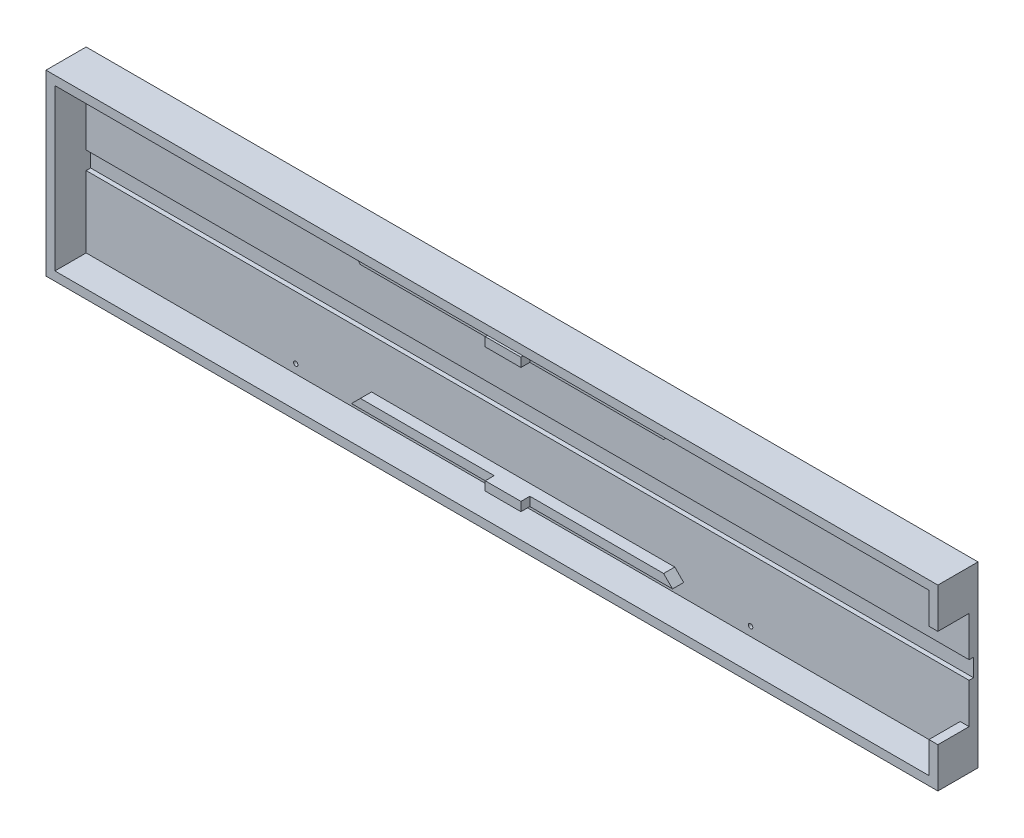
ISO-10303-21;
HEADER;
FILE_DESCRIPTION(('STEP AP214'),'2;1');
FILE_NAME('part.step','',(''),(''),'','','');
FILE_SCHEMA(('AUTOMOTIVE_DESIGN { 1 0 10303 214 1 1 1 1 }'));
ENDSEC;
DATA;
#1=APPLICATION_CONTEXT('core data for automotive mechanical design processes');
#2=APPLICATION_PROTOCOL_DEFINITION('international standard','automotive_design',2000,#1);
#3=PRODUCT_CONTEXT('',#1,'mechanical');
#4=PRODUCT('Part','Part','',(#3));
#5=PRODUCT_RELATED_PRODUCT_CATEGORY('part','',(#4));
#6=PRODUCT_DEFINITION_FORMATION('','',#4);
#7=PRODUCT_DEFINITION_CONTEXT('part definition',#1,'design');
#8=PRODUCT_DEFINITION('design','',#6,#7);
#9=PRODUCT_DEFINITION_SHAPE('','',#8);
#10=(LENGTH_UNIT() NAMED_UNIT(*) SI_UNIT(.MILLI.,.METRE.));
#11=(NAMED_UNIT(*) PLANE_ANGLE_UNIT() SI_UNIT($,.RADIAN.));
#12=(NAMED_UNIT(*) SI_UNIT($,.STERADIAN.) SOLID_ANGLE_UNIT());
#13=UNCERTAINTY_MEASURE_WITH_UNIT(LENGTH_MEASURE(1.E-05),#10,'distance_accuracy_value','');
#14=(GEOMETRIC_REPRESENTATION_CONTEXT(3) GLOBAL_UNCERTAINTY_ASSIGNED_CONTEXT((#13)) GLOBAL_UNIT_ASSIGNED_CONTEXT((#10,
#11,#12)) REPRESENTATION_CONTEXT('',''));
#15=CARTESIAN_POINT('',(0.,0.,0.));
#16=DIRECTION('',(0.,0.,1.));
#17=DIRECTION('',(1.,0.,0.));
#18=AXIS2_PLACEMENT_3D('',#15,#16,#17);
#19=CARTESIAN_POINT('',(104.,5.,4.5));
#20=DIRECTION('',(1.,0.,0.));
#21=DIRECTION('',(0.,0.,-1.));
#22=AXIS2_PLACEMENT_3D('',#19,#20,#21);
#23=PLANE('',#22);
#24=DIRECTION('',(0.,1.,0.));
#25=VECTOR('',#24,1.);
#26=CARTESIAN_POINT('',(104.,7.00000000000002,6.5));
#27=LINE('',#26,#25);
#28=CARTESIAN_POINT('',(104.,5.,6.5));
#29=VERTEX_POINT('',#28);
#30=CARTESIAN_POINT('',(104.,7.00000000000002,6.5));
#31=VERTEX_POINT('',#30);
#32=EDGE_CURVE('E591',#29,#31,#27,.T.);
#33=ORIENTED_EDGE('',*,*,#32,.F.);
#34=DIRECTION('',(0.,0.,1.));
#35=VECTOR('',#34,1.);
#36=CARTESIAN_POINT('',(104.,5.,4.5));
#37=LINE('',#36,#35);
#38=CARTESIAN_POINT('',(104.,5.,4.5));
#39=VERTEX_POINT('',#38);
#40=EDGE_CURVE('E34',#39,#29,#37,.T.);
#41=ORIENTED_EDGE('',*,*,#40,.F.);
#42=DIRECTION('',(0.,1.,0.));
#43=VECTOR('',#42,1.);
#44=CARTESIAN_POINT('',(104.,5.48626909794047,4.5));
#45=LINE('',#44,#43);
#46=CARTESIAN_POINT('',(104.,7.00000000000002,4.5));
#47=VERTEX_POINT('',#46);
#48=EDGE_CURVE('E9',#39,#47,#45,.T.);
#49=ORIENTED_EDGE('',*,*,#48,.T.);
#50=DIRECTION('',(0.,0.,1.));
#51=VECTOR('',#50,1.);
#52=CARTESIAN_POINT('',(104.,7.00000000000002,4.5));
#53=LINE('',#52,#51);
#54=EDGE_CURVE('E25',#47,#31,#53,.T.);
#55=ORIENTED_EDGE('',*,*,#54,.T.);
#56=EDGE_LOOP('',(#33,#41,#49,#55));
#57=FACE_BOUND('',#56,.T.);
#58=ADVANCED_FACE('F15',(#57),#23,.T.);
#59=CARTESIAN_POINT('',(96.,7.00000000000002,4.5));
#60=DIRECTION('',(-1.,0.,0.));
#61=DIRECTION('',(0.,0.,1.));
#62=AXIS2_PLACEMENT_3D('',#59,#60,#61);
#63=PLANE('',#62);
#64=DIRECTION('',(0.,-1.,0.));
#65=VECTOR('',#64,1.);
#66=CARTESIAN_POINT('',(96.,5.,6.5));
#67=LINE('',#66,#65);
#68=CARTESIAN_POINT('',(96.,7.00000000000002,6.5));
#69=VERTEX_POINT('',#68);
#70=CARTESIAN_POINT('',(96.,5.,6.5));
#71=VERTEX_POINT('',#70);
#72=EDGE_CURVE('E598',#69,#71,#67,.T.);
#73=ORIENTED_EDGE('',*,*,#72,.F.);
#74=DIRECTION('',(0.,0.,1.));
#75=VECTOR('',#74,1.);
#76=CARTESIAN_POINT('',(96.,7.00000000000002,4.5));
#77=LINE('',#76,#75);
#78=CARTESIAN_POINT('',(96.,7.00000000000002,4.5));
#79=VERTEX_POINT('',#78);
#80=EDGE_CURVE('E491',#79,#69,#77,.T.);
#81=ORIENTED_EDGE('',*,*,#80,.F.);
#82=DIRECTION('',(0.,-1.,0.));
#83=VECTOR('',#82,1.);
#84=CARTESIAN_POINT('',(96.,6.48626909794048,4.5));
#85=LINE('',#84,#83);
#86=CARTESIAN_POINT('',(96.,5.,4.5));
#87=VERTEX_POINT('',#86);
#88=EDGE_CURVE('E597',#79,#87,#85,.T.);
#89=ORIENTED_EDGE('',*,*,#88,.T.);
#90=DIRECTION('',(0.,0.,1.));
#91=VECTOR('',#90,1.);
#92=CARTESIAN_POINT('',(96.,5.,4.5));
#93=LINE('',#92,#91);
#94=EDGE_CURVE('E477',#87,#71,#93,.T.);
#95=ORIENTED_EDGE('',*,*,#94,.T.);
#96=EDGE_LOOP('',(#73,#81,#89,#95));
#97=FACE_BOUND('',#96,.T.);
#98=ADVANCED_FACE('F431',(#97),#63,.T.);
#99=CARTESIAN_POINT('',(100.,6.00000000000001,6.5));
#100=DIRECTION('',(0.,0.,1.));
#101=DIRECTION('',(1.,0.,0.));
#102=AXIS2_PLACEMENT_3D('',#99,#100,#101);
#103=PLANE('',#102);
#104=DIRECTION('',(1.,0.,0.));
#105=VECTOR('',#104,1.);
#106=CARTESIAN_POINT('',(104.,5.,6.5));
#107=LINE('',#106,#105);
#108=EDGE_CURVE('E603',#71,#29,#107,.T.);
#109=ORIENTED_EDGE('',*,*,#108,.T.);
#110=ORIENTED_EDGE('',*,*,#32,.T.);
#111=DIRECTION('',(-1.,0.,0.));
#112=VECTOR('',#111,1.);
#113=CARTESIAN_POINT('',(96.,7.00000000000002,6.5));
#114=LINE('',#113,#112);
#115=EDGE_CURVE('E599',#31,#69,#114,.T.);
#116=ORIENTED_EDGE('',*,*,#115,.T.);
#117=ORIENTED_EDGE('',*,*,#72,.T.);
#118=EDGE_LOOP('',(#109,#110,#116,#117));
#119=FACE_BOUND('',#118,.T.);
#120=ADVANCED_FACE('F437',(#119),#103,.T.);
#121=CARTESIAN_POINT('',(100.,5.97253819588094,4.5));
#122=DIRECTION('',(0.,0.,1.));
#123=DIRECTION('',(0.,-1.,0.));
#124=AXIS2_PLACEMENT_3D('',#121,#122,#123);
#125=PLANE('',#124);
#126=ORIENTED_EDGE('',*,*,#88,.F.);
#127=DIRECTION('',(-1.,0.,0.));
#128=VECTOR('',#127,1.);
#129=CARTESIAN_POINT('',(66.,7.00000000000003,4.5));
#130=LINE('',#129,#128);
#131=CARTESIAN_POINT('',(66.,7.00000000000003,4.5));
#132=VERTEX_POINT('',#131);
#133=EDGE_CURVE('E485',#79,#132,#130,.T.);
#134=ORIENTED_EDGE('',*,*,#133,.T.);
#135=DIRECTION('',(-0.707106781186551,-0.707106781186544,0.));
#136=VECTOR('',#135,1.);
#137=CARTESIAN_POINT('',(64.,5.00000000000001,4.5));
#138=LINE('',#137,#136);
#139=CARTESIAN_POINT('',(64.,5.00000000000001,4.5));
#140=VERTEX_POINT('',#139);
#141=EDGE_CURVE('E480',#132,#140,#138,.T.);
#142=ORIENTED_EDGE('',*,*,#141,.T.);
#143=DIRECTION('',(1.,0.,0.));
#144=VECTOR('',#143,1.);
#145=CARTESIAN_POINT('',(136.,5.,4.5));
#146=LINE('',#145,#144);
#147=EDGE_CURVE('E470',#140,#87,#146,.T.);
#148=ORIENTED_EDGE('',*,*,#147,.T.);
#149=EDGE_LOOP('',(#126,#134,#142,#148));
#150=FACE_BOUND('',#149,.T.);
#151=ADVANCED_FACE('F445',(#150),#125,.T.);
#152=CARTESIAN_POINT('',(136.,5.,2.));
#153=DIRECTION('',(0.707106781186551,0.707106781186544,0.));
#154=DIRECTION('',(-0.707106781186544,0.707106781186551,0.));
#155=AXIS2_PLACEMENT_3D('',#152,#153,#154);
#156=PLANE('',#155);
#157=DIRECTION('',(-0.707106781186544,0.707106781186551,0.));
#158=VECTOR('',#157,1.);
#159=CARTESIAN_POINT('',(134.,7.00000000000001,4.5));
#160=LINE('',#159,#158);
#161=CARTESIAN_POINT('',(136.,5.,4.5));
#162=VERTEX_POINT('',#161);
#163=CARTESIAN_POINT('',(134.,7.00000000000001,4.5));
#164=VERTEX_POINT('',#163);
#165=EDGE_CURVE('E507',#162,#164,#160,.T.);
#166=ORIENTED_EDGE('',*,*,#165,.F.);
#167=DIRECTION('',(0.,0.,1.));
#168=VECTOR('',#167,1.);
#169=CARTESIAN_POINT('',(136.,5.,2.));
#170=LINE('',#169,#168);
#171=CARTESIAN_POINT('',(136.,5.,2.));
#172=VERTEX_POINT('',#171);
#173=EDGE_CURVE('E492',#172,#162,#170,.T.);
#174=ORIENTED_EDGE('',*,*,#173,.F.);
#175=DIRECTION('',(0.707106781186544,-0.707106781186551,0.));
#176=VECTOR('',#175,1.);
#177=CARTESIAN_POINT('',(123.25,17.75,2.));
#178=LINE('',#177,#176);
#179=CARTESIAN_POINT('',(134.,7.00000000000001,2.));
#180=VERTEX_POINT('',#179);
#181=EDGE_CURVE('E503',#180,#172,#178,.T.);
#182=ORIENTED_EDGE('',*,*,#181,.F.);
#183=DIRECTION('',(0.,0.,1.));
#184=VECTOR('',#183,1.);
#185=CARTESIAN_POINT('',(134.,7.00000000000001,2.));
#186=LINE('',#185,#184);
#187=EDGE_CURVE('E481',#180,#164,#186,.T.);
#188=ORIENTED_EDGE('',*,*,#187,.T.);
#189=EDGE_LOOP('',(#166,#174,#182,#188));
#190=FACE_BOUND('',#189,.T.);
#191=ADVANCED_FACE('F449',(#190),#156,.T.);
#192=CARTESIAN_POINT('',(134.,7.00000000000001,2.));
#193=DIRECTION('',(0.,1.,0.));
#194=DIRECTION('',(-1.,0.,0.));
#195=AXIS2_PLACEMENT_3D('',#192,#193,#194);
#196=PLANE('',#195);
#197=DIRECTION('',(-1.,0.,0.));
#198=VECTOR('',#197,1.);
#199=CARTESIAN_POINT('',(66.,7.00000000000003,4.5));
#200=LINE('',#199,#198);
#201=EDGE_CURVE('E511',#164,#47,#200,.T.);
#202=ORIENTED_EDGE('',*,*,#201,.F.);
#203=ORIENTED_EDGE('',*,*,#187,.F.);
#204=DIRECTION('',(1.,0.,0.));
#205=VECTOR('',#204,1.);
#206=CARTESIAN_POINT('',(117.,7.00000000000002,2.));
#207=LINE('',#206,#205);
#208=CARTESIAN_POINT('',(66.,7.00000000000003,2.));
#209=VERTEX_POINT('',#208);
#210=EDGE_CURVE('E571',#209,#180,#207,.T.);
#211=ORIENTED_EDGE('',*,*,#210,.F.);
#212=DIRECTION('',(0.,0.,1.));
#213=VECTOR('',#212,1.);
#214=CARTESIAN_POINT('',(66.,7.00000000000003,2.));
#215=LINE('',#214,#213);
#216=EDGE_CURVE('E494',#209,#132,#215,.T.);
#217=ORIENTED_EDGE('',*,*,#216,.T.);
#218=ORIENTED_EDGE('',*,*,#133,.F.);
#219=ORIENTED_EDGE('',*,*,#80,.T.);
#220=ORIENTED_EDGE('',*,*,#115,.F.);
#221=ORIENTED_EDGE('',*,*,#54,.F.);
#222=EDGE_LOOP('',(#202,#203,#211,#217,#218,#219,#220,#221));
#223=FACE_BOUND('',#222,.T.);
#224=ADVANCED_FACE('F453',(#223),#196,.T.);
#225=CARTESIAN_POINT('',(66.,7.00000000000003,2.));
#226=DIRECTION('',(-0.707106781186544,0.707106781186551,0.));
#227=DIRECTION('',(-0.707106781186551,-0.707106781186544,0.));
#228=AXIS2_PLACEMENT_3D('',#225,#226,#227);
#229=PLANE('',#228);
#230=ORIENTED_EDGE('',*,*,#141,.F.);
#231=ORIENTED_EDGE('',*,*,#216,.F.);
#232=DIRECTION('',(0.707106781186551,0.707106781186544,0.));
#233=VECTOR('',#232,1.);
#234=CARTESIAN_POINT('',(77.7500000000001,18.75,2.));
#235=LINE('',#234,#233);
#236=CARTESIAN_POINT('',(64.,5.00000000000001,2.));
#237=VERTEX_POINT('',#236);
#238=EDGE_CURVE('E490',#237,#209,#235,.T.);
#239=ORIENTED_EDGE('',*,*,#238,.F.);
#240=DIRECTION('',(0.,0.,1.));
#241=VECTOR('',#240,1.);
#242=CARTESIAN_POINT('',(64.,5.00000000000001,2.));
#243=LINE('',#242,#241);
#244=EDGE_CURVE('E474',#237,#140,#243,.T.);
#245=ORIENTED_EDGE('',*,*,#244,.T.);
#246=EDGE_LOOP('',(#230,#231,#239,#245));
#247=FACE_BOUND('',#246,.T.);
#248=ADVANCED_FACE('F457',(#247),#229,.T.);
#249=CARTESIAN_POINT('',(64.,5.00000000000001,2.));
#250=DIRECTION('',(0.,-1.,0.));
#251=DIRECTION('',(1.,0.,0.));
#252=AXIS2_PLACEMENT_3D('',#249,#250,#251);
#253=PLANE('',#252);
#254=ORIENTED_EDGE('',*,*,#147,.F.);
#255=ORIENTED_EDGE('',*,*,#244,.F.);
#256=DIRECTION('',(-1.,0.,0.));
#257=VECTOR('',#256,1.);
#258=CARTESIAN_POINT('',(82.,5.00000000000001,2.));
#259=LINE('',#258,#257);
#260=EDGE_CURVE('E501',#172,#237,#259,.T.);
#261=ORIENTED_EDGE('',*,*,#260,.F.);
#262=ORIENTED_EDGE('',*,*,#173,.T.);
#263=DIRECTION('',(1.,0.,0.));
#264=VECTOR('',#263,1.);
#265=CARTESIAN_POINT('',(136.,5.,4.5));
#266=LINE('',#265,#264);
#267=EDGE_CURVE('E504',#39,#162,#266,.T.);
#268=ORIENTED_EDGE('',*,*,#267,.F.);
#269=ORIENTED_EDGE('',*,*,#40,.T.);
#270=ORIENTED_EDGE('',*,*,#108,.F.);
#271=ORIENTED_EDGE('',*,*,#94,.F.);
#272=EDGE_LOOP('',(#254,#255,#261,#262,#268,#269,#270,#271));
#273=FACE_BOUND('',#272,.T.);
#274=ADVANCED_FACE('F460',(#273),#253,.T.);
#275=CARTESIAN_POINT('',(100.,5.97253819588094,4.5));
#276=DIRECTION('',(0.,0.,1.));
#277=DIRECTION('',(0.,-1.,0.));
#278=AXIS2_PLACEMENT_3D('',#275,#276,#277);
#279=PLANE('',#278);
#280=ORIENTED_EDGE('',*,*,#48,.F.);
#281=ORIENTED_EDGE('',*,*,#267,.T.);
#282=ORIENTED_EDGE('',*,*,#165,.T.);
#283=ORIENTED_EDGE('',*,*,#201,.T.);
#284=EDGE_LOOP('',(#280,#281,#282,#283));
#285=FACE_BOUND('',#284,.T.);
#286=ADVANCED_FACE('F17',(#285),#279,.T.);
#287=CARTESIAN_POINT('',(104.,35.,4.5));
#288=DIRECTION('',(1.,0.,0.));
#289=DIRECTION('',(0.,0.,-1.));
#290=AXIS2_PLACEMENT_3D('',#287,#288,#289);
#291=PLANE('',#290);
#292=DIRECTION('',(0.,-1.,0.));
#293=VECTOR('',#292,1.);
#294=CARTESIAN_POINT('',(104.,33.,6.5));
#295=LINE('',#294,#293);
#296=CARTESIAN_POINT('',(104.,35.,6.5));
#297=VERTEX_POINT('',#296);
#298=CARTESIAN_POINT('',(104.,33.,6.5));
#299=VERTEX_POINT('',#298);
#300=EDGE_CURVE('E508',#297,#299,#295,.T.);
#301=ORIENTED_EDGE('',*,*,#300,.T.);
#302=DIRECTION('',(0.,0.,1.));
#303=VECTOR('',#302,1.);
#304=CARTESIAN_POINT('',(104.,33.,4.5));
#305=LINE('',#304,#303);
#306=CARTESIAN_POINT('',(104.,33.,4.5));
#307=VERTEX_POINT('',#306);
#308=EDGE_CURVE('E513',#307,#299,#305,.T.);
#309=ORIENTED_EDGE('',*,*,#308,.F.);
#310=DIRECTION('',(0.,-1.,0.));
#311=VECTOR('',#310,1.);
#312=CARTESIAN_POINT('',(104.,34.5137309020595,4.5));
#313=LINE('',#312,#311);
#314=CARTESIAN_POINT('',(104.,35.,4.5));
#315=VERTEX_POINT('',#314);
#316=EDGE_CURVE('E354',#315,#307,#313,.T.);
#317=ORIENTED_EDGE('',*,*,#316,.F.);
#318=DIRECTION('',(0.,0.,1.));
#319=VECTOR('',#318,1.);
#320=CARTESIAN_POINT('',(104.,35.,4.5));
#321=LINE('',#320,#319);
#322=EDGE_CURVE('E512',#315,#297,#321,.T.);
#323=ORIENTED_EDGE('',*,*,#322,.T.);
#324=EDGE_LOOP('',(#301,#309,#317,#323));
#325=FACE_BOUND('',#324,.T.);
#326=ADVANCED_FACE('F466',(#325),#291,.T.);
#327=CARTESIAN_POINT('',(96.,33.,4.5));
#328=DIRECTION('',(-1.,0.,0.));
#329=DIRECTION('',(0.,0.,1.));
#330=AXIS2_PLACEMENT_3D('',#327,#328,#329);
#331=PLANE('',#330);
#332=DIRECTION('',(0.,1.,0.));
#333=VECTOR('',#332,1.);
#334=CARTESIAN_POINT('',(96.,35.,6.5));
#335=LINE('',#334,#333);
#336=CARTESIAN_POINT('',(96.,33.,6.5));
#337=VERTEX_POINT('',#336);
#338=CARTESIAN_POINT('',(96.,35.,6.5));
#339=VERTEX_POINT('',#338);
#340=EDGE_CURVE('E518',#337,#339,#335,.T.);
#341=ORIENTED_EDGE('',*,*,#340,.T.);
#342=DIRECTION('',(0.,0.,1.));
#343=VECTOR('',#342,1.);
#344=CARTESIAN_POINT('',(96.,35.,4.5));
#345=LINE('',#344,#343);
#346=CARTESIAN_POINT('',(96.,35.,4.5));
#347=VERTEX_POINT('',#346);
#348=EDGE_CURVE('E522',#347,#339,#345,.T.);
#349=ORIENTED_EDGE('',*,*,#348,.F.);
#350=DIRECTION('',(0.,1.,0.));
#351=VECTOR('',#350,1.);
#352=CARTESIAN_POINT('',(96.,33.5137309020595,4.5));
#353=LINE('',#352,#351);
#354=CARTESIAN_POINT('',(96.,33.,4.5));
#355=VERTEX_POINT('',#354);
#356=EDGE_CURVE('E526',#355,#347,#353,.T.);
#357=ORIENTED_EDGE('',*,*,#356,.F.);
#358=DIRECTION('',(0.,0.,1.));
#359=VECTOR('',#358,1.);
#360=CARTESIAN_POINT('',(96.,33.,4.5));
#361=LINE('',#360,#359);
#362=EDGE_CURVE('E521',#355,#337,#361,.T.);
#363=ORIENTED_EDGE('',*,*,#362,.T.);
#364=EDGE_LOOP('',(#341,#349,#357,#363));
#365=FACE_BOUND('',#364,.T.);
#366=ADVANCED_FACE('F834',(#365),#331,.T.);
#367=CARTESIAN_POINT('',(100.,34.,6.5));
#368=DIRECTION('',(0.,0.,1.));
#369=DIRECTION('',(1.,0.,0.));
#370=AXIS2_PLACEMENT_3D('',#367,#368,#369);
#371=PLANE('',#370);
#372=DIRECTION('',(1.,0.,0.));
#373=VECTOR('',#372,1.);
#374=CARTESIAN_POINT('',(104.,35.,6.5));
#375=LINE('',#374,#373);
#376=EDGE_CURVE('E525',#339,#297,#375,.T.);
#377=ORIENTED_EDGE('',*,*,#376,.F.);
#378=ORIENTED_EDGE('',*,*,#340,.F.);
#379=DIRECTION('',(-1.,0.,0.));
#380=VECTOR('',#379,1.);
#381=CARTESIAN_POINT('',(96.,33.,6.5));
#382=LINE('',#381,#380);
#383=EDGE_CURVE('E515',#299,#337,#382,.T.);
#384=ORIENTED_EDGE('',*,*,#383,.F.);
#385=ORIENTED_EDGE('',*,*,#300,.F.);
#386=EDGE_LOOP('',(#377,#378,#384,#385));
#387=FACE_BOUND('',#386,.T.);
#388=ADVANCED_FACE('F825',(#387),#371,.T.);
#389=CARTESIAN_POINT('',(100.,34.0274618041191,4.5));
#390=DIRECTION('',(0.,0.,1.));
#391=DIRECTION('',(0.,-1.,0.));
#392=AXIS2_PLACEMENT_3D('',#389,#390,#391);
#393=PLANE('',#392);
#394=ORIENTED_EDGE('',*,*,#356,.T.);
#395=DIRECTION('',(1.,0.,0.));
#396=VECTOR('',#395,1.);
#397=CARTESIAN_POINT('',(136.,35.,4.5));
#398=LINE('',#397,#396);
#399=CARTESIAN_POINT('',(64.,35.,4.5));
#400=VERTEX_POINT('',#399);
#401=EDGE_CURVE('E524',#400,#347,#398,.T.);
#402=ORIENTED_EDGE('',*,*,#401,.F.);
#403=DIRECTION('',(-0.707106781186551,0.707106781186544,0.));
#404=VECTOR('',#403,1.);
#405=CARTESIAN_POINT('',(64.,35.,4.5));
#406=LINE('',#405,#404);
#407=CARTESIAN_POINT('',(66.,33.,4.5));
#408=VERTEX_POINT('',#407);
#409=EDGE_CURVE('E540',#408,#400,#406,.T.);
#410=ORIENTED_EDGE('',*,*,#409,.F.);
#411=DIRECTION('',(-1.,0.,0.));
#412=VECTOR('',#411,1.);
#413=CARTESIAN_POINT('',(66.,33.,4.5));
#414=LINE('',#413,#412);
#415=EDGE_CURVE('E536',#355,#408,#414,.T.);
#416=ORIENTED_EDGE('',*,*,#415,.F.);
#417=EDGE_LOOP('',(#394,#402,#410,#416));
#418=FACE_BOUND('',#417,.T.);
#419=ADVANCED_FACE('F816',(#418),#393,.T.);
#420=CARTESIAN_POINT('',(136.,35.,2.));
#421=DIRECTION('',(0.707106781186551,-0.707106781186544,0.));
#422=DIRECTION('',(0.707106781186544,0.707106781186551,0.));
#423=AXIS2_PLACEMENT_3D('',#420,#421,#422);
#424=PLANE('',#423);
#425=DIRECTION('',(-0.707106781186544,-0.707106781186551,0.));
#426=VECTOR('',#425,1.);
#427=CARTESIAN_POINT('',(134.,33.,4.5));
#428=LINE('',#427,#426);
#429=CARTESIAN_POINT('',(136.,35.,4.5));
#430=VERTEX_POINT('',#429);
#431=CARTESIAN_POINT('',(134.,33.,4.5));
#432=VERTEX_POINT('',#431);
#433=EDGE_CURVE('E529',#430,#432,#428,.T.);
#434=ORIENTED_EDGE('',*,*,#433,.T.);
#435=DIRECTION('',(0.,0.,1.));
#436=VECTOR('',#435,1.);
#437=CARTESIAN_POINT('',(134.,33.,2.));
#438=LINE('',#437,#436);
#439=CARTESIAN_POINT('',(134.,33.,2.));
#440=VERTEX_POINT('',#439);
#441=EDGE_CURVE('E543',#440,#432,#438,.T.);
#442=ORIENTED_EDGE('',*,*,#441,.F.);
#443=DIRECTION('',(-0.707106781186544,-0.707106781186551,0.));
#444=VECTOR('',#443,1.);
#445=CARTESIAN_POINT('',(123.25,22.25,2.));
#446=LINE('',#445,#444);
#447=CARTESIAN_POINT('',(136.,35.,2.));
#448=VERTEX_POINT('',#447);
#449=EDGE_CURVE('E389',#448,#440,#446,.T.);
#450=ORIENTED_EDGE('',*,*,#449,.F.);
#451=DIRECTION('',(0.,0.,1.));
#452=VECTOR('',#451,1.);
#453=CARTESIAN_POINT('',(136.,35.,2.));
#454=LINE('',#453,#452);
#455=EDGE_CURVE('E548',#448,#430,#454,.T.);
#456=ORIENTED_EDGE('',*,*,#455,.T.);
#457=EDGE_LOOP('',(#434,#442,#450,#456));
#458=FACE_BOUND('',#457,.T.);
#459=ADVANCED_FACE('F807',(#458),#424,.T.);
#460=CARTESIAN_POINT('',(134.,33.,2.));
#461=DIRECTION('',(0.,-1.,0.));
#462=DIRECTION('',(1.,0.,0.));
#463=AXIS2_PLACEMENT_3D('',#460,#461,#462);
#464=PLANE('',#463);
#465=DIRECTION('',(-1.,0.,0.));
#466=VECTOR('',#465,1.);
#467=CARTESIAN_POINT('',(66.,33.,4.5));
#468=LINE('',#467,#466);
#469=EDGE_CURVE('E514',#432,#307,#468,.T.);
#470=ORIENTED_EDGE('',*,*,#469,.T.);
#471=ORIENTED_EDGE('',*,*,#308,.T.);
#472=ORIENTED_EDGE('',*,*,#383,.T.);
#473=ORIENTED_EDGE('',*,*,#362,.F.);
#474=ORIENTED_EDGE('',*,*,#415,.T.);
#475=DIRECTION('',(0.,0.,1.));
#476=VECTOR('',#475,1.);
#477=CARTESIAN_POINT('',(66.,33.,2.));
#478=LINE('',#477,#476);
#479=CARTESIAN_POINT('',(66.,33.,2.));
#480=VERTEX_POINT('',#479);
#481=EDGE_CURVE('E539',#480,#408,#478,.T.);
#482=ORIENTED_EDGE('',*,*,#481,.F.);
#483=DIRECTION('',(-1.,0.,0.));
#484=VECTOR('',#483,1.);
#485=CARTESIAN_POINT('',(117.,33.,2.));
#486=LINE('',#485,#484);
#487=EDGE_CURVE('E551',#440,#480,#486,.T.);
#488=ORIENTED_EDGE('',*,*,#487,.F.);
#489=ORIENTED_EDGE('',*,*,#441,.T.);
#490=EDGE_LOOP('',(#470,#471,#472,#473,#474,#482,#488,#489));
#491=FACE_BOUND('',#490,.T.);
#492=ADVANCED_FACE('F798',(#491),#464,.T.);
#493=CARTESIAN_POINT('',(66.,33.,2.));
#494=DIRECTION('',(-0.707106781186544,-0.707106781186551,0.));
#495=DIRECTION('',(0.707106781186551,-0.707106781186544,0.));
#496=AXIS2_PLACEMENT_3D('',#493,#494,#495);
#497=PLANE('',#496);
#498=ORIENTED_EDGE('',*,*,#409,.T.);
#499=DIRECTION('',(0.,0.,1.));
#500=VECTOR('',#499,1.);
#501=CARTESIAN_POINT('',(64.,35.,2.));
#502=LINE('',#501,#500);
#503=CARTESIAN_POINT('',(64.,35.,2.));
#504=VERTEX_POINT('',#503);
#505=EDGE_CURVE('E356',#504,#400,#502,.T.);
#506=ORIENTED_EDGE('',*,*,#505,.F.);
#507=DIRECTION('',(-0.707106781186551,0.707106781186544,0.));
#508=VECTOR('',#507,1.);
#509=CARTESIAN_POINT('',(77.7500000000001,21.25,2.));
#510=LINE('',#509,#508);
#511=EDGE_CURVE('E558',#480,#504,#510,.T.);
#512=ORIENTED_EDGE('',*,*,#511,.F.);
#513=ORIENTED_EDGE('',*,*,#481,.T.);
#514=EDGE_LOOP('',(#498,#506,#512,#513));
#515=FACE_BOUND('',#514,.T.);
#516=ADVANCED_FACE('F789',(#515),#497,.T.);
#517=CARTESIAN_POINT('',(64.,35.,2.));
#518=DIRECTION('',(0.,1.,0.));
#519=DIRECTION('',(-1.,0.,0.));
#520=AXIS2_PLACEMENT_3D('',#517,#518,#519);
#521=PLANE('',#520);
#522=ORIENTED_EDGE('',*,*,#401,.T.);
#523=ORIENTED_EDGE('',*,*,#348,.T.);
#524=ORIENTED_EDGE('',*,*,#376,.T.);
#525=ORIENTED_EDGE('',*,*,#322,.F.);
#526=DIRECTION('',(1.,0.,0.));
#527=VECTOR('',#526,1.);
#528=CARTESIAN_POINT('',(136.,35.,4.5));
#529=LINE('',#528,#527);
#530=EDGE_CURVE('E533',#315,#430,#529,.T.);
#531=ORIENTED_EDGE('',*,*,#530,.T.);
#532=ORIENTED_EDGE('',*,*,#455,.F.);
#533=DIRECTION('',(1.,0.,0.));
#534=VECTOR('',#533,1.);
#535=CARTESIAN_POINT('',(82.,35.,2.));
#536=LINE('',#535,#534);
#537=EDGE_CURVE('E280',#504,#448,#536,.T.);
#538=ORIENTED_EDGE('',*,*,#537,.F.);
#539=ORIENTED_EDGE('',*,*,#505,.T.);
#540=EDGE_LOOP('',(#522,#523,#524,#525,#531,#532,#538,#539));
#541=FACE_BOUND('',#540,.T.);
#542=ADVANCED_FACE('F781',(#541),#521,.T.);
#543=CARTESIAN_POINT('',(100.,34.0274618041191,4.5));
#544=DIRECTION('',(0.,0.,1.));
#545=DIRECTION('',(0.,-1.,0.));
#546=AXIS2_PLACEMENT_3D('',#543,#544,#545);
#547=PLANE('',#546);
#548=ORIENTED_EDGE('',*,*,#316,.T.);
#549=ORIENTED_EDGE('',*,*,#469,.F.);
#550=ORIENTED_EDGE('',*,*,#433,.F.);
#551=ORIENTED_EDGE('',*,*,#530,.F.);
#552=EDGE_LOOP('',(#548,#549,#550,#551));
#553=FACE_BOUND('',#552,.T.);
#554=ADVANCED_FACE('F624',(#553),#547,.T.);
#555=CARTESIAN_POINT('',(151.,4.,-202.159251566026));
#556=DIRECTION('',(0.,0.,1.));
#557=DIRECTION('',(1.,0.,0.));
#558=AXIS2_PLACEMENT_3D('',#555,#556,#557);
#559=CYLINDRICAL_SURFACE('',#558,0.5);
#560=CARTESIAN_POINT('',(151.,4.,0.));
#561=DIRECTION('',(0.,0.,1.));
#562=DIRECTION('',(1.,0.,0.));
#563=AXIS2_PLACEMENT_3D('',#560,#561,#562);
#564=CIRCLE('',#563,0.5);
#565=CARTESIAN_POINT('',(151.5,4.,0.));
#566=VERTEX_POINT('',#565);
#567=EDGE_CURVE('E252',#566,#566,#564,.T.);
#568=ORIENTED_EDGE('',*,*,#567,.F.);
#569=EDGE_LOOP('',(#568));
#570=FACE_BOUND('',#569,.T.);
#571=CARTESIAN_POINT('',(151.,4.,1.99999999999999));
#572=DIRECTION('',(0.,0.,-1.));
#573=DIRECTION('',(0.,-1.,0.));
#574=AXIS2_PLACEMENT_3D('',#571,#572,#573);
#575=CIRCLE('',#574,0.5);
#576=CARTESIAN_POINT('',(151.,3.5,1.99999999999999));
#577=VERTEX_POINT('',#576);
#578=EDGE_CURVE('E569',#577,#577,#575,.T.);
#579=ORIENTED_EDGE('',*,*,#578,.F.);
#580=EDGE_LOOP('',(#579));
#581=FACE_BOUND('',#580,.T.);
#582=ADVANCED_FACE('F616',(#570,#581),#559,.F.);
#583=CARTESIAN_POINT('',(49.,4.,-202.159251566026));
#584=DIRECTION('',(0.,0.,1.));
#585=DIRECTION('',(1.,0.,0.));
#586=AXIS2_PLACEMENT_3D('',#583,#584,#585);
#587=CYLINDRICAL_SURFACE('',#586,0.5);
#588=CARTESIAN_POINT('',(49.,4.,0.));
#589=DIRECTION('',(0.,0.,1.));
#590=DIRECTION('',(1.,0.,0.));
#591=AXIS2_PLACEMENT_3D('',#588,#589,#590);
#592=CIRCLE('',#591,0.5);
#593=CARTESIAN_POINT('',(49.5,4.,0.));
#594=VERTEX_POINT('',#593);
#595=EDGE_CURVE('E568',#594,#594,#592,.T.);
#596=ORIENTED_EDGE('',*,*,#595,.F.);
#597=EDGE_LOOP('',(#596));
#598=FACE_BOUND('',#597,.T.);
#599=CARTESIAN_POINT('',(49.,4.,1.99999999999999));
#600=DIRECTION('',(0.,0.,-1.));
#601=DIRECTION('',(0.,-1.,0.));
#602=AXIS2_PLACEMENT_3D('',#599,#600,#601);
#603=CIRCLE('',#602,0.5);
#604=CARTESIAN_POINT('',(49.,3.5,1.99999999999999));
#605=VERTEX_POINT('',#604);
#606=EDGE_CURVE('E337',#605,#605,#603,.T.);
#607=ORIENTED_EDGE('',*,*,#606,.F.);
#608=EDGE_LOOP('',(#607));
#609=FACE_BOUND('',#608,.T.);
#610=ADVANCED_FACE('F614',(#598,#609),#587,.F.);
#611=CARTESIAN_POINT('',(200.,31.,2.));
#612=DIRECTION('',(0.,-1.,0.));
#613=DIRECTION('',(1.,0.,0.));
#614=AXIS2_PLACEMENT_3D('',#611,#612,#613);
#615=PLANE('',#614);
#616=DIRECTION('',(-1.,0.,0.));
#617=VECTOR('',#616,1.);
#618=CARTESIAN_POINT('',(200.,31.,9.));
#619=LINE('',#618,#617);
#620=CARTESIAN_POINT('',(200.,31.,9.));
#621=VERTEX_POINT('',#620);
#622=CARTESIAN_POINT('',(198.,31.,9.));
#623=VERTEX_POINT('',#622);
#624=EDGE_CURVE('E348',#621,#623,#619,.T.);
#625=ORIENTED_EDGE('',*,*,#624,.T.);
#626=DIRECTION('',(0.,0.,1.));
#627=VECTOR('',#626,1.);
#628=CARTESIAN_POINT('',(198.,31.,2.));
#629=LINE('',#628,#627);
#630=CARTESIAN_POINT('',(198.,31.,2.));
#631=VERTEX_POINT('',#630);
#632=EDGE_CURVE('E362',#631,#623,#629,.T.);
#633=ORIENTED_EDGE('',*,*,#632,.F.);
#634=DIRECTION('',(-1.,0.,0.));
#635=VECTOR('',#634,1.);
#636=CARTESIAN_POINT('',(150.,31.0000000000003,2.));
#637=LINE('',#636,#635);
#638=CARTESIAN_POINT('',(200.,31.,2.));
#639=VERTEX_POINT('',#638);
#640=EDGE_CURVE('E284',#639,#631,#637,.T.);
#641=ORIENTED_EDGE('',*,*,#640,.F.);
#642=DIRECTION('',(0.,0.,1.));
#643=VECTOR('',#642,1.);
#644=CARTESIAN_POINT('',(200.,31.,2.));
#645=LINE('',#644,#643);
#646=EDGE_CURVE('E341',#639,#621,#645,.T.);
#647=ORIENTED_EDGE('',*,*,#646,.T.);
#648=EDGE_LOOP('',(#625,#633,#641,#647));
#649=FACE_BOUND('',#648,.T.);
#650=ADVANCED_FACE('F415',(#649),#615,.T.);
#651=CARTESIAN_POINT('',(198.,31.,2.));
#652=DIRECTION('',(-1.,0.,0.));
#653=DIRECTION('',(0.,-1.,0.));
#654=AXIS2_PLACEMENT_3D('',#651,#652,#653);
#655=PLANE('',#654);
#656=DIRECTION('',(0.,1.,0.));
#657=VECTOR('',#656,1.);
#658=CARTESIAN_POINT('',(198.,31.,9.));
#659=LINE('',#658,#657);
#660=CARTESIAN_POINT('',(198.,38.,9.));
#661=VERTEX_POINT('',#660);
#662=EDGE_CURVE('E351',#623,#661,#659,.T.);
#663=ORIENTED_EDGE('',*,*,#662,.T.);
#664=DIRECTION('',(0.,0.,1.));
#665=VECTOR('',#664,1.);
#666=CARTESIAN_POINT('',(198.,38.,2.));
#667=LINE('',#666,#665);
#668=CARTESIAN_POINT('',(198.,38.,2.));
#669=VERTEX_POINT('',#668);
#670=EDGE_CURVE('E368',#669,#661,#667,.T.);
#671=ORIENTED_EDGE('',*,*,#670,.F.);
#672=DIRECTION('',(0.,1.,0.));
#673=VECTOR('',#672,1.);
#674=CARTESIAN_POINT('',(198.,25.4999999999998,2.));
#675=LINE('',#674,#673);
#676=EDGE_CURVE('E365',#631,#669,#675,.T.);
#677=ORIENTED_EDGE('',*,*,#676,.F.);
#678=ORIENTED_EDGE('',*,*,#632,.T.);
#679=EDGE_LOOP('',(#663,#671,#677,#678));
#680=FACE_BOUND('',#679,.T.);
#681=ADVANCED_FACE('F414',(#680),#655,.T.);
#682=CARTESIAN_POINT('',(198.,38.,2.));
#683=DIRECTION('',(0.,-1.,0.));
#684=DIRECTION('',(1.,0.,0.));
#685=AXIS2_PLACEMENT_3D('',#682,#683,#684);
#686=PLANE('',#685);
#687=DIRECTION('',(-1.,0.,0.));
#688=VECTOR('',#687,1.);
#689=CARTESIAN_POINT('',(198.,38.,9.));
#690=LINE('',#689,#688);
#691=CARTESIAN_POINT('',(1.99999999999999,38.,9.));
#692=VERTEX_POINT('',#691);
#693=EDGE_CURVE('E364',#661,#692,#690,.T.);
#694=ORIENTED_EDGE('',*,*,#693,.T.);
#695=DIRECTION('',(0.,0.,1.));
#696=VECTOR('',#695,1.);
#697=CARTESIAN_POINT('',(1.99999999999999,38.,2.));
#698=LINE('',#697,#696);
#699=CARTESIAN_POINT('',(1.99999999999999,38.,2.));
#700=VERTEX_POINT('',#699);
#701=EDGE_CURVE('E275',#700,#692,#698,.T.);
#702=ORIENTED_EDGE('',*,*,#701,.F.);
#703=DIRECTION('',(-1.,0.,0.));
#704=VECTOR('',#703,1.);
#705=CARTESIAN_POINT('',(149.,38.,2.));
#706=LINE('',#705,#704);
#707=EDGE_CURVE('E296',#669,#700,#706,.T.);
#708=ORIENTED_EDGE('',*,*,#707,.F.);
#709=ORIENTED_EDGE('',*,*,#670,.T.);
#710=EDGE_LOOP('',(#694,#702,#708,#709));
#711=FACE_BOUND('',#710,.T.);
#712=ADVANCED_FACE('F410',(#711),#686,.T.);
#713=CARTESIAN_POINT('',(2.,1.99999999999999,2.));
#714=DIRECTION('',(0.,1.,0.));
#715=DIRECTION('',(-1.,0.,0.));
#716=AXIS2_PLACEMENT_3D('',#713,#714,#715);
#717=PLANE('',#716);
#718=DIRECTION('',(1.,0.,0.));
#719=VECTOR('',#718,1.);
#720=CARTESIAN_POINT('',(2.,1.99999999999999,9.));
#721=LINE('',#720,#719);
#722=CARTESIAN_POINT('',(2.,1.99999999999999,9.));
#723=VERTEX_POINT('',#722);
#724=CARTESIAN_POINT('',(198.,2.00000000000001,9.));
#725=VERTEX_POINT('',#724);
#726=EDGE_CURVE('E370',#723,#725,#721,.T.);
#727=ORIENTED_EDGE('',*,*,#726,.T.);
#728=DIRECTION('',(0.,0.,1.));
#729=VECTOR('',#728,1.);
#730=CARTESIAN_POINT('',(198.,2.00000000000001,2.));
#731=LINE('',#730,#729);
#732=CARTESIAN_POINT('',(198.,2.00000000000001,2.));
#733=VERTEX_POINT('',#732);
#734=EDGE_CURVE('E380',#733,#725,#731,.T.);
#735=ORIENTED_EDGE('',*,*,#734,.F.);
#736=DIRECTION('',(1.,0.,0.));
#737=VECTOR('',#736,1.);
#738=CARTESIAN_POINT('',(51.,1.99999999999999,2.));
#739=LINE('',#738,#737);
#740=CARTESIAN_POINT('',(2.,1.99999999999999,2.));
#741=VERTEX_POINT('',#740);
#742=EDGE_CURVE('E302',#741,#733,#739,.T.);
#743=ORIENTED_EDGE('',*,*,#742,.F.);
#744=DIRECTION('',(0.,0.,1.));
#745=VECTOR('',#744,1.);
#746=CARTESIAN_POINT('',(2.,1.99999999999999,2.));
#747=LINE('',#746,#745);
#748=EDGE_CURVE('E379',#741,#723,#747,.T.);
#749=ORIENTED_EDGE('',*,*,#748,.T.);
#750=EDGE_LOOP('',(#727,#735,#743,#749));
#751=FACE_BOUND('',#750,.T.);
#752=ADVANCED_FACE('F633',(#751),#717,.T.);
#753=CARTESIAN_POINT('',(198.,2.00000000000001,2.));
#754=DIRECTION('',(-1.,0.,0.));
#755=DIRECTION('',(0.,0.,1.));
#756=AXIS2_PLACEMENT_3D('',#753,#754,#755);
#757=PLANE('',#756);
#758=DIRECTION('',(0.,1.,0.));
#759=VECTOR('',#758,1.);
#760=CARTESIAN_POINT('',(198.,2.00000000000001,9.));
#761=LINE('',#760,#759);
#762=CARTESIAN_POINT('',(198.,9.00000000000001,9.));
#763=VERTEX_POINT('',#762);
#764=EDGE_CURVE('E382',#725,#763,#761,.T.);
#765=ORIENTED_EDGE('',*,*,#764,.T.);
#766=DIRECTION('',(0.,0.,1.));
#767=VECTOR('',#766,1.);
#768=CARTESIAN_POINT('',(198.,9.00000000000001,2.));
#769=LINE('',#768,#767);
#770=CARTESIAN_POINT('',(198.,9.00000000000001,2.));
#771=VERTEX_POINT('',#770);
#772=EDGE_CURVE('E388',#771,#763,#769,.T.);
#773=ORIENTED_EDGE('',*,*,#772,.F.);
#774=DIRECTION('',(0.,1.,0.));
#775=VECTOR('',#774,1.);
#776=CARTESIAN_POINT('',(198.,11.,2.));
#777=LINE('',#776,#775);
#778=EDGE_CURVE('E384',#733,#771,#777,.T.);
#779=ORIENTED_EDGE('',*,*,#778,.F.);
#780=ORIENTED_EDGE('',*,*,#734,.T.);
#781=EDGE_LOOP('',(#765,#773,#779,#780));
#782=FACE_BOUND('',#781,.T.);
#783=ADVANCED_FACE('F394',(#782),#757,.T.);
#784=CARTESIAN_POINT('',(198.,9.00000000000001,2.));
#785=DIRECTION('',(0.,1.,0.));
#786=DIRECTION('',(-1.,0.,0.));
#787=AXIS2_PLACEMENT_3D('',#784,#785,#786);
#788=PLANE('',#787);
#789=DIRECTION('',(1.,0.,0.));
#790=VECTOR('',#789,1.);
#791=CARTESIAN_POINT('',(198.,9.00000000000001,9.));
#792=LINE('',#791,#790);
#793=CARTESIAN_POINT('',(200.,9.,9.));
#794=VERTEX_POINT('',#793);
#795=EDGE_CURVE('E335',#763,#794,#792,.T.);
#796=ORIENTED_EDGE('',*,*,#795,.T.);
#797=DIRECTION('',(0.,0.,1.));
#798=VECTOR('',#797,1.);
#799=CARTESIAN_POINT('',(200.,9.,2.));
#800=LINE('',#799,#798);
#801=CARTESIAN_POINT('',(200.,9.,2.));
#802=VERTEX_POINT('',#801);
#803=EDGE_CURVE('E271',#802,#794,#800,.T.);
#804=ORIENTED_EDGE('',*,*,#803,.F.);
#805=DIRECTION('',(1.,0.,0.));
#806=VECTOR('',#805,1.);
#807=CARTESIAN_POINT('',(149.,9.0000000000002,2.));
#808=LINE('',#807,#806);
#809=EDGE_CURVE('E309',#771,#802,#808,.T.);
#810=ORIENTED_EDGE('',*,*,#809,.F.);
#811=ORIENTED_EDGE('',*,*,#772,.T.);
#812=EDGE_LOOP('',(#796,#804,#810,#811));
#813=FACE_BOUND('',#812,.T.);
#814=ADVANCED_FACE('F398',(#813),#788,.T.);
#815=CARTESIAN_POINT('',(95.6194690265487,20.,9.));
#816=DIRECTION('',(0.,0.,1.));
#817=DIRECTION('',(0.,-1.,0.));
#818=AXIS2_PLACEMENT_3D('',#815,#816,#817);
#819=PLANE('',#818);
#820=ORIENTED_EDGE('',*,*,#624,.F.);
#821=DIRECTION('',(0.,-1.,0.));
#822=VECTOR('',#821,1.);
#823=CARTESIAN_POINT('',(200.,40.,9.));
#824=LINE('',#823,#822);
#825=CARTESIAN_POINT('',(200.,40.,9.));
#826=VERTEX_POINT('',#825);
#827=EDGE_CURVE('E263',#826,#621,#824,.T.);
#828=ORIENTED_EDGE('',*,*,#827,.F.);
#829=DIRECTION('',(1.,0.,0.));
#830=VECTOR('',#829,1.);
#831=CARTESIAN_POINT('',(0.,40.,9.));
#832=LINE('',#831,#830);
#833=CARTESIAN_POINT('',(0.,40.,9.));
#834=VERTEX_POINT('',#833);
#835=EDGE_CURVE('E248',#834,#826,#832,.T.);
#836=ORIENTED_EDGE('',*,*,#835,.F.);
#837=DIRECTION('',(0.,1.,0.));
#838=VECTOR('',#837,1.);
#839=CARTESIAN_POINT('',(0.,0.,9.));
#840=LINE('',#839,#838);
#841=CARTESIAN_POINT('',(0.,0.,9.));
#842=VERTEX_POINT('',#841);
#843=EDGE_CURVE('E236',#842,#834,#840,.T.);
#844=ORIENTED_EDGE('',*,*,#843,.F.);
#845=DIRECTION('',(-1.,0.,0.));
#846=VECTOR('',#845,1.);
#847=CARTESIAN_POINT('',(200.,0.,9.));
#848=LINE('',#847,#846);
#849=CARTESIAN_POINT('',(200.,0.,9.));
#850=VERTEX_POINT('',#849);
#851=EDGE_CURVE('E233',#850,#842,#848,.T.);
#852=ORIENTED_EDGE('',*,*,#851,.F.);
#853=DIRECTION('',(0.,-1.,0.));
#854=VECTOR('',#853,1.);
#855=CARTESIAN_POINT('',(200.,18.,9.));
#856=LINE('',#855,#854);
#857=EDGE_CURVE('E259',#794,#850,#856,.T.);
#858=ORIENTED_EDGE('',*,*,#857,.F.);
#859=ORIENTED_EDGE('',*,*,#795,.F.);
#860=ORIENTED_EDGE('',*,*,#764,.F.);
#861=ORIENTED_EDGE('',*,*,#726,.F.);
#862=DIRECTION('',(0.,-1.,0.));
#863=VECTOR('',#862,1.);
#864=CARTESIAN_POINT('',(1.99999999999999,38.,9.));
#865=LINE('',#864,#863);
#866=EDGE_CURVE('E272',#692,#723,#865,.T.);
#867=ORIENTED_EDGE('',*,*,#866,.F.);
#868=ORIENTED_EDGE('',*,*,#693,.F.);
#869=ORIENTED_EDGE('',*,*,#662,.F.);
#870=EDGE_LOOP('',(#820,#828,#836,#844,#852,#858,#859,#860,#861,#867,#868,#869));
#871=FACE_BOUND('',#870,.T.);
#872=ADVANCED_FACE('F345',(#871),#819,.T.);
#873=CARTESIAN_POINT('',(100.,20.,2.));
#874=DIRECTION('',(0.,0.,1.));
#875=DIRECTION('',(1.,0.,0.));
#876=AXIS2_PLACEMENT_3D('',#873,#874,#875);
#877=PLANE('',#876);
#878=ORIENTED_EDGE('',*,*,#449,.T.);
#879=ORIENTED_EDGE('',*,*,#487,.T.);
#880=ORIENTED_EDGE('',*,*,#511,.T.);
#881=ORIENTED_EDGE('',*,*,#537,.T.);
#882=EDGE_LOOP('',(#878,#879,#880,#881));
#883=FACE_BOUND('',#882,.T.);
#884=DIRECTION('',(0.,-1.,0.));
#885=VECTOR('',#884,1.);
#886=CARTESIAN_POINT('',(1.99999999999999,29.,2.));
#887=LINE('',#886,#885);
#888=CARTESIAN_POINT('',(1.99999999999999,22.,2.));
#889=VERTEX_POINT('',#888);
#890=EDGE_CURVE('E277',#700,#889,#887,.T.);
#891=ORIENTED_EDGE('',*,*,#890,.T.);
#892=DIRECTION('',(1.,0.,0.));
#893=VECTOR('',#892,1.);
#894=CARTESIAN_POINT('',(150.,22.,2.));
#895=LINE('',#894,#893);
#896=CARTESIAN_POINT('',(200.,22.,2.));
#897=VERTEX_POINT('',#896);
#898=EDGE_CURVE('E281',#889,#897,#895,.T.);
#899=ORIENTED_EDGE('',*,*,#898,.T.);
#900=DIRECTION('',(0.,-1.,0.));
#901=VECTOR('',#900,1.);
#902=CARTESIAN_POINT('',(200.,0.,2.));
#903=LINE('',#902,#901);
#904=EDGE_CURVE('E242',#639,#897,#903,.T.);
#905=ORIENTED_EDGE('',*,*,#904,.F.);
#906=ORIENTED_EDGE('',*,*,#640,.T.);
#907=ORIENTED_EDGE('',*,*,#676,.T.);
#908=ORIENTED_EDGE('',*,*,#707,.T.);
#909=EDGE_LOOP('',(#891,#899,#905,#906,#907,#908));
#910=FACE_BOUND('',#909,.T.);
#911=ADVANCED_FACE('F417',(#883,#910),#877,.T.);
#912=CARTESIAN_POINT('',(200.,22.,2.));
#913=DIRECTION('',(0.,1.,0.));
#914=DIRECTION('',(-1.,0.,0.));
#915=AXIS2_PLACEMENT_3D('',#912,#913,#914);
#916=PLANE('',#915);
#917=DIRECTION('',(-1.,0.,0.));
#918=VECTOR('',#917,1.);
#919=CARTESIAN_POINT('',(200.,22.,1.));
#920=LINE('',#919,#918);
#921=CARTESIAN_POINT('',(200.,22.,1.));
#922=VERTEX_POINT('',#921);
#923=CARTESIAN_POINT('',(1.99999999999999,22.,1.));
#924=VERTEX_POINT('',#923);
#925=EDGE_CURVE('E286',#922,#924,#920,.T.);
#926=ORIENTED_EDGE('',*,*,#925,.F.);
#927=DIRECTION('',(0.,0.,-1.));
#928=VECTOR('',#927,1.);
#929=CARTESIAN_POINT('',(200.,22.,1.));
#930=LINE('',#929,#928);
#931=EDGE_CURVE('E289',#897,#922,#930,.T.);
#932=ORIENTED_EDGE('',*,*,#931,.F.);
#933=ORIENTED_EDGE('',*,*,#898,.F.);
#934=DIRECTION('',(0.,0.,-1.));
#935=VECTOR('',#934,1.);
#936=CARTESIAN_POINT('',(1.99999999999999,22.,2.));
#937=LINE('',#936,#935);
#938=EDGE_CURVE('E293',#889,#924,#937,.T.);
#939=ORIENTED_EDGE('',*,*,#938,.T.);
#940=EDGE_LOOP('',(#926,#932,#933,#939));
#941=FACE_BOUND('',#940,.T.);
#942=ADVANCED_FACE('F419',(#941),#916,.F.);
#943=CARTESIAN_POINT('',(1.99999999999999,22.,2.));
#944=DIRECTION('',(-1.,0.,0.));
#945=DIRECTION('',(0.,0.,1.));
#946=AXIS2_PLACEMENT_3D('',#943,#944,#945);
#947=PLANE('',#946);
#948=DIRECTION('',(0.,-1.,0.));
#949=VECTOR('',#948,1.);
#950=CARTESIAN_POINT('',(1.99999999999999,22.,1.));
#951=LINE('',#950,#949);
#952=CARTESIAN_POINT('',(1.99999999999999,18.,1.));
#953=VERTEX_POINT('',#952);
#954=EDGE_CURVE('E288',#924,#953,#951,.T.);
#955=ORIENTED_EDGE('',*,*,#954,.F.);
#956=ORIENTED_EDGE('',*,*,#938,.F.);
#957=ORIENTED_EDGE('',*,*,#890,.F.);
#958=ORIENTED_EDGE('',*,*,#701,.T.);
#959=ORIENTED_EDGE('',*,*,#866,.T.);
#960=ORIENTED_EDGE('',*,*,#748,.F.);
#961=DIRECTION('',(0.,-1.,0.));
#962=VECTOR('',#961,1.);
#963=CARTESIAN_POINT('',(1.99999999999999,29.,2.));
#964=LINE('',#963,#962);
#965=CARTESIAN_POINT('',(1.99999999999999,18.,2.));
#966=VERTEX_POINT('',#965);
#967=EDGE_CURVE('E298',#966,#741,#964,.T.);
#968=ORIENTED_EDGE('',*,*,#967,.F.);
#969=DIRECTION('',(0.,0.,-1.));
#970=VECTOR('',#969,1.);
#971=CARTESIAN_POINT('',(1.99999999999999,18.,2.));
#972=LINE('',#971,#970);
#973=EDGE_CURVE('E276',#966,#953,#972,.T.);
#974=ORIENTED_EDGE('',*,*,#973,.T.);
#975=EDGE_LOOP('',(#955,#956,#957,#958,#959,#960,#968,#974));
#976=FACE_BOUND('',#975,.T.);
#977=ADVANCED_FACE('F405',(#976),#947,.F.);
#978=CARTESIAN_POINT('',(1.99999999999999,18.,2.));
#979=DIRECTION('',(0.,-1.,0.));
#980=DIRECTION('',(1.,0.,0.));
#981=AXIS2_PLACEMENT_3D('',#978,#979,#980);
#982=PLANE('',#981);
#983=DIRECTION('',(1.,0.,0.));
#984=VECTOR('',#983,1.);
#985=CARTESIAN_POINT('',(1.99999999999999,18.,1.));
#986=LINE('',#985,#984);
#987=CARTESIAN_POINT('',(200.,18.,1.));
#988=VERTEX_POINT('',#987);
#989=EDGE_CURVE('E291',#953,#988,#986,.T.);
#990=ORIENTED_EDGE('',*,*,#989,.F.);
#991=ORIENTED_EDGE('',*,*,#973,.F.);
#992=DIRECTION('',(-1.,0.,0.));
#993=VECTOR('',#992,1.);
#994=CARTESIAN_POINT('',(51.,18.,2.));
#995=LINE('',#994,#993);
#996=CARTESIAN_POINT('',(200.,18.,2.));
#997=VERTEX_POINT('',#996);
#998=EDGE_CURVE('E301',#997,#966,#995,.T.);
#999=ORIENTED_EDGE('',*,*,#998,.F.);
#1000=DIRECTION('',(0.,0.,1.));
#1001=VECTOR('',#1000,1.);
#1002=CARTESIAN_POINT('',(200.,18.,1.));
#1003=LINE('',#1002,#1001);
#1004=EDGE_CURVE('E310',#988,#997,#1003,.T.);
#1005=ORIENTED_EDGE('',*,*,#1004,.F.);
#1006=EDGE_LOOP('',(#990,#991,#999,#1005));
#1007=FACE_BOUND('',#1006,.T.);
#1008=ADVANCED_FACE('F326',(#1007),#982,.F.);
#1009=CARTESIAN_POINT('',(101.,20.,1.));
#1010=DIRECTION('',(0.,0.,1.));
#1011=DIRECTION('',(0.,-1.,0.));
#1012=AXIS2_PLACEMENT_3D('',#1009,#1010,#1011);
#1013=PLANE('',#1012);
#1014=ORIENTED_EDGE('',*,*,#925,.T.);
#1015=ORIENTED_EDGE('',*,*,#954,.T.);
#1016=ORIENTED_EDGE('',*,*,#989,.T.);
#1017=DIRECTION('',(0.,-1.,0.));
#1018=VECTOR('',#1017,1.);
#1019=CARTESIAN_POINT('',(200.,30.,1.));
#1020=LINE('',#1019,#1018);
#1021=EDGE_CURVE('E292',#922,#988,#1020,.T.);
#1022=ORIENTED_EDGE('',*,*,#1021,.F.);
#1023=EDGE_LOOP('',(#1014,#1015,#1016,#1022));
#1024=FACE_BOUND('',#1023,.T.);
#1025=ADVANCED_FACE('F321',(#1024),#1013,.T.);
#1026=CARTESIAN_POINT('',(200.,40.,0.));
#1027=DIRECTION('',(1.,0.,0.));
#1028=DIRECTION('',(0.,0.,-1.));
#1029=AXIS2_PLACEMENT_3D('',#1026,#1027,#1028);
#1030=PLANE('',#1029);
#1031=ORIENTED_EDGE('',*,*,#931,.T.);
#1032=ORIENTED_EDGE('',*,*,#1021,.T.);
#1033=ORIENTED_EDGE('',*,*,#1004,.T.);
#1034=DIRECTION('',(0.,-1.,0.));
#1035=VECTOR('',#1034,1.);
#1036=CARTESIAN_POINT('',(200.,0.,2.));
#1037=LINE('',#1036,#1035);
#1038=EDGE_CURVE('E256',#997,#802,#1037,.T.);
#1039=ORIENTED_EDGE('',*,*,#1038,.T.);
#1040=ORIENTED_EDGE('',*,*,#803,.T.);
#1041=ORIENTED_EDGE('',*,*,#857,.T.);
#1042=DIRECTION('',(0.,0.,1.));
#1043=VECTOR('',#1042,1.);
#1044=CARTESIAN_POINT('',(200.,0.,0.));
#1045=LINE('',#1044,#1043);
#1046=CARTESIAN_POINT('',(200.,0.,0.));
#1047=VERTEX_POINT('',#1046);
#1048=EDGE_CURVE('E249',#1047,#850,#1045,.T.);
#1049=ORIENTED_EDGE('',*,*,#1048,.F.);
#1050=DIRECTION('',(0.,1.,0.));
#1051=VECTOR('',#1050,1.);
#1052=CARTESIAN_POINT('',(200.,0.,0.));
#1053=LINE('',#1052,#1051);
#1054=CARTESIAN_POINT('',(200.,40.,0.));
#1055=VERTEX_POINT('',#1054);
#1056=EDGE_CURVE('E247',#1047,#1055,#1053,.T.);
#1057=ORIENTED_EDGE('',*,*,#1056,.T.);
#1058=DIRECTION('',(0.,0.,1.));
#1059=VECTOR('',#1058,1.);
#1060=CARTESIAN_POINT('',(200.,40.,0.));
#1061=LINE('',#1060,#1059);
#1062=EDGE_CURVE('E260',#1055,#826,#1061,.T.);
#1063=ORIENTED_EDGE('',*,*,#1062,.T.);
#1064=ORIENTED_EDGE('',*,*,#827,.T.);
#1065=ORIENTED_EDGE('',*,*,#646,.F.);
#1066=ORIENTED_EDGE('',*,*,#904,.T.);
#1067=EDGE_LOOP('',(#1031,#1032,#1033,#1039,#1040,#1041,#1049,#1057,#1063,#1064,#1065,#1066));
#1068=FACE_BOUND('',#1067,.T.);
#1069=ADVANCED_FACE('F315',(#1068),#1030,.T.);
#1070=CARTESIAN_POINT('',(0.,0.,0.));
#1071=DIRECTION('',(-1.,0.,0.));
#1072=DIRECTION('',(0.,0.,1.));
#1073=AXIS2_PLACEMENT_3D('',#1070,#1071,#1072);
#1074=PLANE('',#1073);
#1075=DIRECTION('',(0.,0.,1.));
#1076=VECTOR('',#1075,1.);
#1077=CARTESIAN_POINT('',(0.,40.,0.));
#1078=LINE('',#1077,#1076);
#1079=CARTESIAN_POINT('',(0.,40.,0.));
#1080=VERTEX_POINT('',#1079);
#1081=EDGE_CURVE('E223',#1080,#834,#1078,.T.);
#1082=ORIENTED_EDGE('',*,*,#1081,.F.);
#1083=DIRECTION('',(0.,-1.,0.));
#1084=VECTOR('',#1083,1.);
#1085=CARTESIAN_POINT('',(0.,40.,0.));
#1086=LINE('',#1085,#1084);
#1087=CARTESIAN_POINT('',(0.,0.,0.));
#1088=VERTEX_POINT('',#1087);
#1089=EDGE_CURVE('E235',#1080,#1088,#1086,.T.);
#1090=ORIENTED_EDGE('',*,*,#1089,.T.);
#1091=DIRECTION('',(0.,0.,1.));
#1092=VECTOR('',#1091,1.);
#1093=CARTESIAN_POINT('',(0.,0.,0.));
#1094=LINE('',#1093,#1092);
#1095=EDGE_CURVE('E229',#1088,#842,#1094,.T.);
#1096=ORIENTED_EDGE('',*,*,#1095,.T.);
#1097=ORIENTED_EDGE('',*,*,#843,.T.);
#1098=EDGE_LOOP('',(#1082,#1090,#1096,#1097));
#1099=FACE_BOUND('',#1098,.T.);
#1100=ADVANCED_FACE('F238',(#1099),#1074,.T.);
#1101=CARTESIAN_POINT('',(0.,40.,0.));
#1102=DIRECTION('',(0.,1.,0.));
#1103=DIRECTION('',(0.,0.,1.));
#1104=AXIS2_PLACEMENT_3D('',#1101,#1102,#1103);
#1105=PLANE('',#1104);
#1106=ORIENTED_EDGE('',*,*,#1062,.F.);
#1107=DIRECTION('',(-1.,0.,0.));
#1108=VECTOR('',#1107,1.);
#1109=CARTESIAN_POINT('',(200.,40.,0.));
#1110=LINE('',#1109,#1108);
#1111=EDGE_CURVE('E264',#1055,#1080,#1110,.T.);
#1112=ORIENTED_EDGE('',*,*,#1111,.T.);
#1113=ORIENTED_EDGE('',*,*,#1081,.T.);
#1114=ORIENTED_EDGE('',*,*,#835,.T.);
#1115=EDGE_LOOP('',(#1106,#1112,#1113,#1114));
#1116=FACE_BOUND('',#1115,.T.);
#1117=ADVANCED_FACE('F697',(#1116),#1105,.T.);
#1118=CARTESIAN_POINT('',(200.,0.,0.));
#1119=DIRECTION('',(0.,-1.,0.));
#1120=DIRECTION('',(0.,0.,-1.));
#1121=AXIS2_PLACEMENT_3D('',#1118,#1119,#1120);
#1122=PLANE('',#1121);
#1123=ORIENTED_EDGE('',*,*,#1095,.F.);
#1124=DIRECTION('',(1.,0.,0.));
#1125=VECTOR('',#1124,1.);
#1126=CARTESIAN_POINT('',(0.,0.,0.));
#1127=LINE('',#1126,#1125);
#1128=EDGE_CURVE('E19',#1088,#1047,#1127,.T.);
#1129=ORIENTED_EDGE('',*,*,#1128,.T.);
#1130=ORIENTED_EDGE('',*,*,#1048,.T.);
#1131=ORIENTED_EDGE('',*,*,#851,.T.);
#1132=EDGE_LOOP('',(#1123,#1129,#1130,#1131));
#1133=FACE_BOUND('',#1132,.T.);
#1134=ADVANCED_FACE('F230',(#1133),#1122,.T.);
#1135=CARTESIAN_POINT('',(100.,20.,0.));
#1136=DIRECTION('',(0.,0.,1.));
#1137=DIRECTION('',(1.,0.,0.));
#1138=AXIS2_PLACEMENT_3D('',#1135,#1136,#1137);
#1139=PLANE('',#1138);
#1140=ORIENTED_EDGE('',*,*,#567,.T.);
#1141=EDGE_LOOP('',(#1140));
#1142=FACE_BOUND('',#1141,.T.);
#1143=ORIENTED_EDGE('',*,*,#595,.T.);
#1144=EDGE_LOOP('',(#1143));
#1145=FACE_BOUND('',#1144,.T.);
#1146=ORIENTED_EDGE('',*,*,#1128,.F.);
#1147=ORIENTED_EDGE('',*,*,#1089,.F.);
#1148=ORIENTED_EDGE('',*,*,#1111,.F.);
#1149=ORIENTED_EDGE('',*,*,#1056,.F.);
#1150=EDGE_LOOP('',(#1146,#1147,#1148,#1149));
#1151=FACE_BOUND('',#1150,.T.);
#1152=ADVANCED_FACE('F245',(#1142,#1145,#1151),#1139,.F.);
#1153=CARTESIAN_POINT('',(100.,20.,2.));
#1154=DIRECTION('',(0.,0.,1.));
#1155=DIRECTION('',(1.,0.,0.));
#1156=AXIS2_PLACEMENT_3D('',#1153,#1154,#1155);
#1157=PLANE('',#1156);
#1158=ORIENTED_EDGE('',*,*,#181,.T.);
#1159=ORIENTED_EDGE('',*,*,#260,.T.);
#1160=ORIENTED_EDGE('',*,*,#238,.T.);
#1161=ORIENTED_EDGE('',*,*,#210,.T.);
#1162=EDGE_LOOP('',(#1158,#1159,#1160,#1161));
#1163=FACE_BOUND('',#1162,.T.);
#1164=ORIENTED_EDGE('',*,*,#578,.T.);
#1165=EDGE_LOOP('',(#1164));
#1166=FACE_BOUND('',#1165,.T.);
#1167=ORIENTED_EDGE('',*,*,#606,.T.);
#1168=EDGE_LOOP('',(#1167));
#1169=FACE_BOUND('',#1168,.T.);
#1170=ORIENTED_EDGE('',*,*,#809,.T.);
#1171=ORIENTED_EDGE('',*,*,#1038,.F.);
#1172=ORIENTED_EDGE('',*,*,#998,.T.);
#1173=ORIENTED_EDGE('',*,*,#967,.T.);
#1174=ORIENTED_EDGE('',*,*,#742,.T.);
#1175=ORIENTED_EDGE('',*,*,#778,.T.);
#1176=EDGE_LOOP('',(#1170,#1171,#1172,#1173,#1174,#1175));
#1177=FACE_BOUND('',#1176,.T.);
#1178=ADVANCED_FACE('F328',(#1163,#1166,#1169,#1177),#1157,.T.);
#1179=CLOSED_SHELL('',(#58,#98,#120,#151,#191,#224,#248,#274,#286,#326,#366,#388,#419,#459,#492,
#516,#542,#554,#582,#610,#650,#681,#712,#752,#783,#814,#872,#911,#942,#977,#1008,#1025,#1069,
#1100,#1117,#1134,#1152,#1178));
#1180=MANIFOLD_SOLID_BREP('B1',#1179);
#1181=ADVANCED_BREP_SHAPE_REPRESENTATION('',(#18,#1180),#14);
#1182=SHAPE_DEFINITION_REPRESENTATION(#9,#1181);
ENDSEC;
END-ISO-10303-21;
